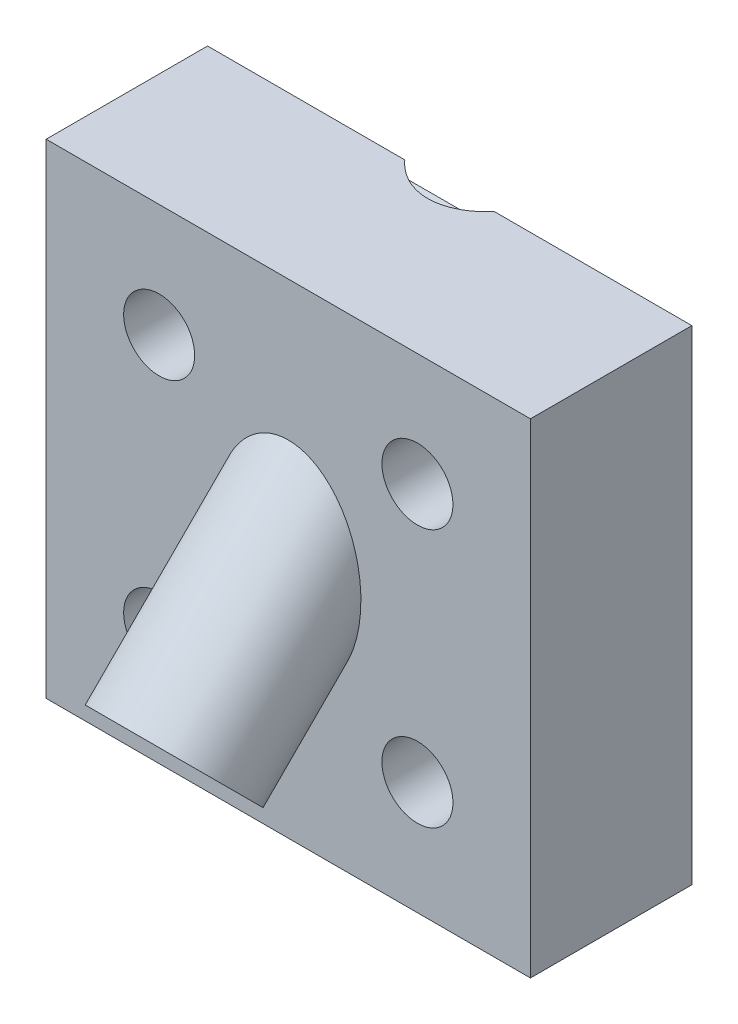
ISO-10303-21;
HEADER;
FILE_DESCRIPTION(('STEP AP214'),'2;1');
FILE_NAME('part.step','',(''),(''),'','','');
FILE_SCHEMA(('AUTOMOTIVE_DESIGN { 1 0 10303 214 1 1 1 1 }'));
ENDSEC;
DATA;
#1=APPLICATION_CONTEXT('core data for automotive mechanical design processes');
#2=APPLICATION_PROTOCOL_DEFINITION('international standard','automotive_design',2000,#1);
#3=PRODUCT_CONTEXT('',#1,'mechanical');
#4=PRODUCT('Part','Part','',(#3));
#5=PRODUCT_RELATED_PRODUCT_CATEGORY('part','',(#4));
#6=PRODUCT_DEFINITION_FORMATION('','',#4);
#7=PRODUCT_DEFINITION_CONTEXT('part definition',#1,'design');
#8=PRODUCT_DEFINITION('design','',#6,#7);
#9=PRODUCT_DEFINITION_SHAPE('','',#8);
#10=(LENGTH_UNIT() NAMED_UNIT(*) SI_UNIT(.MILLI.,.METRE.));
#11=(NAMED_UNIT(*) PLANE_ANGLE_UNIT() SI_UNIT($,.RADIAN.));
#12=(NAMED_UNIT(*) SI_UNIT($,.STERADIAN.) SOLID_ANGLE_UNIT());
#13=UNCERTAINTY_MEASURE_WITH_UNIT(LENGTH_MEASURE(1.E-05),#10,'distance_accuracy_value','');
#14=(GEOMETRIC_REPRESENTATION_CONTEXT(3) GLOBAL_UNCERTAINTY_ASSIGNED_CONTEXT((#13)) GLOBAL_UNIT_ASSIGNED_CONTEXT((#10,
#11,#12)) REPRESENTATION_CONTEXT('',''));
#15=CARTESIAN_POINT('',(0.,0.,0.));
#16=DIRECTION('',(0.,0.,1.));
#17=DIRECTION('',(1.,0.,0.));
#18=AXIS2_PLACEMENT_3D('',#15,#16,#17);
#19=CARTESIAN_POINT('',(7.5,-0.428932188134514,-3.07106781186546));
#20=DIRECTION('',(0.,-0.707106781186549,0.707106781186546));
#21=DIRECTION('',(0.,-0.707106781186546,-0.707106781186549));
#22=AXIS2_PLACEMENT_3D('',#19,#20,#21);
#23=CYLINDRICAL_SURFACE('',#22,2.25);
#24=CARTESIAN_POINT('',(7.5,-2.49999999999998,-1.));
#25=DIRECTION('',(0.,0.,1.));
#26=DIRECTION('',(0.,-1.,0.));
#27=AXIS2_PLACEMENT_3D('',#24,#25,#26);
#28=ELLIPSE('',#27,3.18198051533947,2.25);
#29=CARTESIAN_POINT('',(5.76199746786343,-0.479184719828697,-1.));
#30=VERTEX_POINT('',#29);
#31=CARTESIAN_POINT('',(9.23800253213657,-0.479184719828697,-1.));
#32=VERTEX_POINT('',#31);
#33=EDGE_CURVE('E185',#30,#32,#28,.T.);
#34=ORIENTED_EDGE('',*,*,#33,.F.);
#35=CARTESIAN_POINT('',(7.5,-1.48959235991434,-2.01040764008564));
#36=DIRECTION('',(0.,0.707106781186549,-0.707106781186546));
#37=DIRECTION('',(0.,0.707106781186546,0.707106781186549));
#38=AXIS2_PLACEMENT_3D('',#35,#36,#37);
#39=CIRCLE('',#38,2.25);
#40=EDGE_CURVE('E117',#32,#30,#39,.T.);
#41=ORIENTED_EDGE('',*,*,#40,.F.);
#42=EDGE_LOOP('',(#34,#41));
#43=FACE_BOUND('',#42,.T.);
#44=ADVANCED_FACE('F41',(#43),#23,.T.);
#45=CARTESIAN_POINT('',(7.5,0.,-3.49999999999998));
#46=DIRECTION('',(0.,-1.,0.));
#47=DIRECTION('',(0.,0.,1.));
#48=AXIS2_PLACEMENT_3D('',#45,#46,#47);
#49=ELLIPSE('',#48,3.18198051533946,2.25);
#50=CARTESIAN_POINT('',(8.29039812915369,0.,-0.520815280171302));
#51=VERTEX_POINT('',#50);
#52=CARTESIAN_POINT('',(6.70960187084631,0.,-0.520815280171302));
#53=VERTEX_POINT('',#52);
#54=EDGE_CURVE('E118',#51,#53,#49,.T.);
#55=ORIENTED_EDGE('',*,*,#54,.F.);
#56=EDGE_CURVE('E105',#53,#51,#39,.T.);
#57=ORIENTED_EDGE('',*,*,#56,.F.);
#58=EDGE_LOOP('',(#55,#57));
#59=FACE_BOUND('',#58,.T.);
#60=ADVANCED_FACE('F119',(#59),#23,.T.);
#61=CARTESIAN_POINT('',(7.5,19.3700576850888,-22.8700576850888));
#62=DIRECTION('',(0.,-0.707106781186549,0.707106781186546));
#63=DIRECTION('',(0.,-0.707106781186546,-0.707106781186549));
#64=AXIS2_PLACEMENT_3D('',#61,#62,#63);
#65=CYLINDRICAL_SURFACE('',#64,1.5);
#66=CARTESIAN_POINT('',(7.5,-11.0355339059327,7.53553390593273));
#67=DIRECTION('',(0.,-0.707106781186549,0.707106781186546));
#68=DIRECTION('',(0.,-0.707106781186546,-0.707106781186549));
#69=AXIS2_PLACEMENT_3D('',#66,#67,#68);
#70=CIRCLE('',#69,1.5);
#71=CARTESIAN_POINT('',(7.5,-12.0961940777126,6.4748737341529));
#72=VERTEX_POINT('',#71);
#73=EDGE_CURVE('E191',#72,#72,#70,.T.);
#74=ORIENTED_EDGE('',*,*,#73,.T.);
#75=EDGE_LOOP('',(#74));
#76=FACE_BOUND('',#75,.T.);
#77=CARTESIAN_POINT('',(7.5,-1.48959235991434,-2.01040764008565));
#78=DIRECTION('',(0.,0.707106781186549,-0.707106781186546));
#79=DIRECTION('',(0.,0.707106781186546,0.707106781186549));
#80=AXIS2_PLACEMENT_3D('',#77,#78,#79);
#81=CIRCLE('',#80,1.5);
#82=CARTESIAN_POINT('',(7.5,-0.42893218813452,-0.949747468305831));
#83=VERTEX_POINT('',#82);
#84=EDGE_CURVE('E44',#83,#83,#81,.F.);
#85=ORIENTED_EDGE('',*,*,#84,.F.);
#86=EDGE_LOOP('',(#85));
#87=FACE_BOUND('',#86,.T.);
#88=ADVANCED_FACE('F218',(#76,#87),#65,.F.);
#89=CARTESIAN_POINT('',(0.,0.,4.));
#90=DIRECTION('',(0.,0.,1.));
#91=DIRECTION('',(1.,0.,0.));
#92=AXIS2_PLACEMENT_3D('',#89,#90,#91);
#93=PLANE('',#92);
#94=CARTESIAN_POINT('',(7.5,-7.5,4.));
#95=DIRECTION('',(0.,0.,1.));
#96=DIRECTION('',(0.,-1.,0.));
#97=AXIS2_PLACEMENT_3D('',#94,#95,#96);
#98=ELLIPSE('',#97,3.18198051533947,2.25);
#99=CARTESIAN_POINT('',(7.5,-10.6819805153395,4.));
#100=VERTEX_POINT('',#99);
#101=EDGE_CURVE('E11',#100,#100,#98,.T.);
#102=ORIENTED_EDGE('',*,*,#101,.F.);
#103=EDGE_LOOP('',(#102));
#104=FACE_BOUND('',#103,.T.);
#105=CARTESIAN_POINT('',(11.5,-11.5,4.));
#106=DIRECTION('',(0.,0.,1.));
#107=DIRECTION('',(1.,0.,0.));
#108=AXIS2_PLACEMENT_3D('',#105,#106,#107);
#109=CIRCLE('',#108,1.1);
#110=CARTESIAN_POINT('',(12.6,-11.5,4.));
#111=VERTEX_POINT('',#110);
#112=EDGE_CURVE('E156',#111,#111,#109,.T.);
#113=ORIENTED_EDGE('',*,*,#112,.F.);
#114=EDGE_LOOP('',(#113));
#115=FACE_BOUND('',#114,.T.);
#116=CARTESIAN_POINT('',(3.5,-3.5,4.));
#117=DIRECTION('',(0.,0.,1.));
#118=DIRECTION('',(1.,0.,0.));
#119=AXIS2_PLACEMENT_3D('',#116,#117,#118);
#120=CIRCLE('',#119,1.1);
#121=CARTESIAN_POINT('',(4.6,-3.5,4.));
#122=VERTEX_POINT('',#121);
#123=EDGE_CURVE('E164',#122,#122,#120,.T.);
#124=ORIENTED_EDGE('',*,*,#123,.F.);
#125=EDGE_LOOP('',(#124));
#126=FACE_BOUND('',#125,.T.);
#127=DIRECTION('',(0.,-1.,0.));
#128=VECTOR('',#127,1.);
#129=CARTESIAN_POINT('',(0.,0.,4.));
#130=LINE('',#129,#128);
#131=CARTESIAN_POINT('',(0.,0.,4.));
#132=VERTEX_POINT('',#131);
#133=CARTESIAN_POINT('',(0.,-15.,4.));
#134=VERTEX_POINT('',#133);
#135=EDGE_CURVE('E166',#132,#134,#130,.T.);
#136=ORIENTED_EDGE('',*,*,#135,.T.);
#137=DIRECTION('',(1.,0.,0.));
#138=VECTOR('',#137,1.);
#139=CARTESIAN_POINT('',(0.,-15.,4.));
#140=LINE('',#139,#138);
#141=CARTESIAN_POINT('',(15.,-15.,4.));
#142=VERTEX_POINT('',#141);
#143=EDGE_CURVE('E167',#134,#142,#140,.T.);
#144=ORIENTED_EDGE('',*,*,#143,.T.);
#145=DIRECTION('',(0.,1.,0.));
#146=VECTOR('',#145,1.);
#147=CARTESIAN_POINT('',(15.,0.,4.));
#148=LINE('',#147,#146);
#149=CARTESIAN_POINT('',(15.,0.,4.));
#150=VERTEX_POINT('',#149);
#151=EDGE_CURVE('E175',#142,#150,#148,.T.);
#152=ORIENTED_EDGE('',*,*,#151,.T.);
#153=DIRECTION('',(-1.,0.,0.));
#154=VECTOR('',#153,1.);
#155=CARTESIAN_POINT('',(0.,0.,4.));
#156=LINE('',#155,#154);
#157=EDGE_CURVE('E66',#150,#132,#156,.T.);
#158=ORIENTED_EDGE('',*,*,#157,.T.);
#159=EDGE_LOOP('',(#136,#144,#152,#158));
#160=FACE_BOUND('',#159,.T.);
#161=CARTESIAN_POINT('',(11.5,-3.5,4.));
#162=DIRECTION('',(0.,0.,1.));
#163=DIRECTION('',(1.,0.,0.));
#164=AXIS2_PLACEMENT_3D('',#161,#162,#163);
#165=CIRCLE('',#164,1.1);
#166=CARTESIAN_POINT('',(12.6,-3.5,4.));
#167=VERTEX_POINT('',#166);
#168=EDGE_CURVE('E162',#167,#167,#165,.T.);
#169=ORIENTED_EDGE('',*,*,#168,.F.);
#170=EDGE_LOOP('',(#169));
#171=FACE_BOUND('',#170,.T.);
#172=CARTESIAN_POINT('',(3.5,-11.5,4.));
#173=DIRECTION('',(0.,0.,1.));
#174=DIRECTION('',(1.,0.,0.));
#175=AXIS2_PLACEMENT_3D('',#172,#173,#174);
#176=CIRCLE('',#175,1.1);
#177=CARTESIAN_POINT('',(4.6,-11.5,4.));
#178=VERTEX_POINT('',#177);
#179=EDGE_CURVE('E157',#178,#178,#176,.T.);
#180=ORIENTED_EDGE('',*,*,#179,.F.);
#181=EDGE_LOOP('',(#180));
#182=FACE_BOUND('',#181,.T.);
#183=ADVANCED_FACE('F224',(#104,#115,#126,#160,#171,#182),#93,.T.);
#184=CARTESIAN_POINT('',(0.,0.,4.));
#185=DIRECTION('',(1.,0.,0.));
#186=DIRECTION('',(0.,1.,0.));
#187=AXIS2_PLACEMENT_3D('',#184,#185,#186);
#188=PLANE('',#187);
#189=DIRECTION('',(0.,0.,-1.));
#190=VECTOR('',#189,1.);
#191=CARTESIAN_POINT('',(0.,0.,4.));
#192=LINE('',#191,#190);
#193=CARTESIAN_POINT('',(0.,0.,-1.));
#194=VERTEX_POINT('',#193);
#195=EDGE_CURVE('E174',#132,#194,#192,.T.);
#196=ORIENTED_EDGE('',*,*,#195,.T.);
#197=DIRECTION('',(0.,1.,0.));
#198=VECTOR('',#197,1.);
#199=CARTESIAN_POINT('',(0.,0.,-1.));
#200=LINE('',#199,#198);
#201=CARTESIAN_POINT('',(0.,-15.,-1.));
#202=VERTEX_POINT('',#201);
#203=EDGE_CURVE('E153',#202,#194,#200,.T.);
#204=ORIENTED_EDGE('',*,*,#203,.F.);
#205=DIRECTION('',(0.,0.,-1.));
#206=VECTOR('',#205,1.);
#207=CARTESIAN_POINT('',(0.,-15.,4.));
#208=LINE('',#207,#206);
#209=EDGE_CURVE('E181',#134,#202,#208,.T.);
#210=ORIENTED_EDGE('',*,*,#209,.F.);
#211=ORIENTED_EDGE('',*,*,#135,.F.);
#212=EDGE_LOOP('',(#196,#204,#210,#211));
#213=FACE_BOUND('',#212,.T.);
#214=ADVANCED_FACE('F43',(#213),#188,.F.);
#215=CARTESIAN_POINT('',(0.,-15.,4.));
#216=DIRECTION('',(0.,1.,0.));
#217=DIRECTION('',(0.,0.,1.));
#218=AXIS2_PLACEMENT_3D('',#215,#216,#217);
#219=PLANE('',#218);
#220=ORIENTED_EDGE('',*,*,#209,.T.);
#221=DIRECTION('',(-1.,0.,0.));
#222=VECTOR('',#221,1.);
#223=CARTESIAN_POINT('',(0.,-15.,-1.));
#224=LINE('',#223,#222);
#225=CARTESIAN_POINT('',(15.,-15.,-1.));
#226=VERTEX_POINT('',#225);
#227=EDGE_CURVE('E147',#226,#202,#224,.T.);
#228=ORIENTED_EDGE('',*,*,#227,.F.);
#229=DIRECTION('',(0.,0.,-1.));
#230=VECTOR('',#229,1.);
#231=CARTESIAN_POINT('',(15.,-15.,4.));
#232=LINE('',#231,#230);
#233=EDGE_CURVE('E177',#142,#226,#232,.T.);
#234=ORIENTED_EDGE('',*,*,#233,.F.);
#235=ORIENTED_EDGE('',*,*,#143,.F.);
#236=EDGE_LOOP('',(#220,#228,#234,#235));
#237=FACE_BOUND('',#236,.T.);
#238=ADVANCED_FACE('F247',(#237),#219,.F.);
#239=CARTESIAN_POINT('',(15.,0.,4.));
#240=DIRECTION('',(-1.,0.,0.));
#241=DIRECTION('',(0.,-1.,0.));
#242=AXIS2_PLACEMENT_3D('',#239,#240,#241);
#243=PLANE('',#242);
#244=ORIENTED_EDGE('',*,*,#233,.T.);
#245=DIRECTION('',(0.,-1.,0.));
#246=VECTOR('',#245,1.);
#247=CARTESIAN_POINT('',(15.,0.,-1.));
#248=LINE('',#247,#246);
#249=CARTESIAN_POINT('',(15.,0.,-1.));
#250=VERTEX_POINT('',#249);
#251=EDGE_CURVE('E146',#250,#226,#248,.T.);
#252=ORIENTED_EDGE('',*,*,#251,.F.);
#253=DIRECTION('',(0.,0.,-1.));
#254=VECTOR('',#253,1.);
#255=CARTESIAN_POINT('',(15.,0.,4.));
#256=LINE('',#255,#254);
#257=EDGE_CURVE('E180',#150,#250,#256,.T.);
#258=ORIENTED_EDGE('',*,*,#257,.F.);
#259=ORIENTED_EDGE('',*,*,#151,.F.);
#260=EDGE_LOOP('',(#244,#252,#258,#259));
#261=FACE_BOUND('',#260,.T.);
#262=ADVANCED_FACE('F246',(#261),#243,.F.);
#263=CARTESIAN_POINT('',(0.,0.,4.));
#264=DIRECTION('',(0.,-1.,0.));
#265=DIRECTION('',(0.,0.,-1.));
#266=AXIS2_PLACEMENT_3D('',#263,#264,#265);
#267=PLANE('',#266);
#268=DIRECTION('',(1.,0.,0.));
#269=VECTOR('',#268,1.);
#270=CARTESIAN_POINT('',(15.,0.,-1.));
#271=LINE('',#270,#269);
#272=CARTESIAN_POINT('',(8.89194109070752,0.,-1.));
#273=VERTEX_POINT('',#272);
#274=EDGE_CURVE('E130',#273,#250,#271,.T.);
#275=ORIENTED_EDGE('',*,*,#274,.F.);
#276=EDGE_CURVE('E114',#273,#51,#49,.T.);
#277=ORIENTED_EDGE('',*,*,#276,.T.);
#278=ORIENTED_EDGE('',*,*,#54,.T.);
#279=CARTESIAN_POINT('',(7.5,0.,-3.49999999999998));
#280=DIRECTION('',(0.,-1.,0.));
#281=DIRECTION('',(0.,0.,-1.));
#282=AXIS2_PLACEMENT_3D('',#279,#280,#281);
#283=ELLIPSE('',#282,3.18198051533946,2.25);
#284=CARTESIAN_POINT('',(6.10805890929248,0.,-1.));
#285=VERTEX_POINT('',#284);
#286=EDGE_CURVE('E195',#53,#285,#283,.T.);
#287=ORIENTED_EDGE('',*,*,#286,.T.);
#288=EDGE_CURVE('E144',#194,#285,#271,.T.);
#289=ORIENTED_EDGE('',*,*,#288,.F.);
#290=ORIENTED_EDGE('',*,*,#195,.F.);
#291=ORIENTED_EDGE('',*,*,#157,.F.);
#292=ORIENTED_EDGE('',*,*,#257,.T.);
#293=EDGE_LOOP('',(#275,#277,#278,#287,#289,#290,#291,#292));
#294=FACE_BOUND('',#293,.T.);
#295=ADVANCED_FACE('F129',(#294),#267,.F.);
#296=CARTESIAN_POINT('',(3.5,-3.5,4.));
#297=DIRECTION('',(0.,0.,-1.));
#298=DIRECTION('',(-1.,0.,0.));
#299=AXIS2_PLACEMENT_3D('',#296,#297,#298);
#300=CYLINDRICAL_SURFACE('',#299,1.1);
#301=ORIENTED_EDGE('',*,*,#123,.T.);
#302=EDGE_LOOP('',(#301));
#303=FACE_BOUND('',#302,.T.);
#304=CARTESIAN_POINT('',(3.5,-3.5,-1.));
#305=DIRECTION('',(0.,0.,-1.));
#306=DIRECTION('',(-1.,0.,0.));
#307=AXIS2_PLACEMENT_3D('',#304,#305,#306);
#308=CIRCLE('',#307,1.1);
#309=CARTESIAN_POINT('',(2.4,-3.5,-1.));
#310=VERTEX_POINT('',#309);
#311=EDGE_CURVE('E142',#310,#310,#308,.T.);
#312=ORIENTED_EDGE('',*,*,#311,.T.);
#313=EDGE_LOOP('',(#312));
#314=FACE_BOUND('',#313,.T.);
#315=ADVANCED_FACE('F239',(#303,#314),#300,.F.);
#316=CARTESIAN_POINT('',(11.5,-3.5,4.));
#317=DIRECTION('',(0.,0.,-1.));
#318=DIRECTION('',(-1.,0.,0.));
#319=AXIS2_PLACEMENT_3D('',#316,#317,#318);
#320=CYLINDRICAL_SURFACE('',#319,1.1);
#321=ORIENTED_EDGE('',*,*,#168,.T.);
#322=EDGE_LOOP('',(#321));
#323=FACE_BOUND('',#322,.T.);
#324=CARTESIAN_POINT('',(11.5,-3.5,-1.));
#325=DIRECTION('',(0.,0.,-1.));
#326=DIRECTION('',(-1.,0.,0.));
#327=AXIS2_PLACEMENT_3D('',#324,#325,#326);
#328=CIRCLE('',#327,1.1);
#329=CARTESIAN_POINT('',(10.4,-3.5,-1.));
#330=VERTEX_POINT('',#329);
#331=EDGE_CURVE('E140',#330,#330,#328,.T.);
#332=ORIENTED_EDGE('',*,*,#331,.T.);
#333=EDGE_LOOP('',(#332));
#334=FACE_BOUND('',#333,.T.);
#335=ADVANCED_FACE('F236',(#323,#334),#320,.F.);
#336=CARTESIAN_POINT('',(11.5,-11.5,4.));
#337=DIRECTION('',(0.,0.,-1.));
#338=DIRECTION('',(-1.,0.,0.));
#339=AXIS2_PLACEMENT_3D('',#336,#337,#338);
#340=CYLINDRICAL_SURFACE('',#339,1.1);
#341=ORIENTED_EDGE('',*,*,#112,.T.);
#342=EDGE_LOOP('',(#341));
#343=FACE_BOUND('',#342,.T.);
#344=CARTESIAN_POINT('',(11.5,-11.5,-1.));
#345=DIRECTION('',(0.,0.,-1.));
#346=DIRECTION('',(-1.,0.,0.));
#347=AXIS2_PLACEMENT_3D('',#344,#345,#346);
#348=CIRCLE('',#347,1.1);
#349=CARTESIAN_POINT('',(10.4,-11.5,-1.));
#350=VERTEX_POINT('',#349);
#351=EDGE_CURVE('E131',#350,#350,#348,.T.);
#352=ORIENTED_EDGE('',*,*,#351,.T.);
#353=EDGE_LOOP('',(#352));
#354=FACE_BOUND('',#353,.T.);
#355=ADVANCED_FACE('F235',(#343,#354),#340,.F.);
#356=CARTESIAN_POINT('',(3.5,-11.5,4.));
#357=DIRECTION('',(0.,0.,-1.));
#358=DIRECTION('',(-1.,0.,0.));
#359=AXIS2_PLACEMENT_3D('',#356,#357,#358);
#360=CYLINDRICAL_SURFACE('',#359,1.1);
#361=ORIENTED_EDGE('',*,*,#179,.T.);
#362=EDGE_LOOP('',(#361));
#363=FACE_BOUND('',#362,.T.);
#364=CARTESIAN_POINT('',(3.5,-11.5,-1.));
#365=DIRECTION('',(0.,0.,-1.));
#366=DIRECTION('',(-1.,0.,0.));
#367=AXIS2_PLACEMENT_3D('',#364,#365,#366);
#368=CIRCLE('',#367,1.1);
#369=CARTESIAN_POINT('',(2.4,-11.5,-1.));
#370=VERTEX_POINT('',#369);
#371=EDGE_CURVE('E128',#370,#370,#368,.T.);
#372=ORIENTED_EDGE('',*,*,#371,.T.);
#373=EDGE_LOOP('',(#372));
#374=FACE_BOUND('',#373,.T.);
#375=ADVANCED_FACE('F215',(#363,#374),#360,.F.);
#376=CARTESIAN_POINT('',(0.,0.,-1.));
#377=DIRECTION('',(0.,0.,1.));
#378=DIRECTION('',(1.,0.,0.));
#379=AXIS2_PLACEMENT_3D('',#376,#377,#378);
#380=PLANE('',#379);
#381=ORIENTED_EDGE('',*,*,#288,.T.);
#382=EDGE_CURVE('E49',#285,#30,#28,.T.);
#383=ORIENTED_EDGE('',*,*,#382,.T.);
#384=ORIENTED_EDGE('',*,*,#33,.T.);
#385=CARTESIAN_POINT('',(7.5,-2.49999999999998,-1.));
#386=DIRECTION('',(0.,0.,1.));
#387=DIRECTION('',(0.,1.,0.));
#388=AXIS2_PLACEMENT_3D('',#385,#386,#387);
#389=ELLIPSE('',#388,3.18198051533947,2.25);
#390=EDGE_CURVE('E120',#32,#273,#389,.T.);
#391=ORIENTED_EDGE('',*,*,#390,.T.);
#392=ORIENTED_EDGE('',*,*,#274,.T.);
#393=ORIENTED_EDGE('',*,*,#251,.T.);
#394=ORIENTED_EDGE('',*,*,#227,.T.);
#395=ORIENTED_EDGE('',*,*,#203,.T.);
#396=EDGE_LOOP('',(#381,#383,#384,#391,#392,#393,#394,#395));
#397=FACE_BOUND('',#396,.T.);
#398=ORIENTED_EDGE('',*,*,#311,.F.);
#399=EDGE_LOOP('',(#398));
#400=FACE_BOUND('',#399,.T.);
#401=ORIENTED_EDGE('',*,*,#331,.F.);
#402=EDGE_LOOP('',(#401));
#403=FACE_BOUND('',#402,.T.);
#404=ORIENTED_EDGE('',*,*,#351,.F.);
#405=EDGE_LOOP('',(#404));
#406=FACE_BOUND('',#405,.T.);
#407=ORIENTED_EDGE('',*,*,#371,.F.);
#408=EDGE_LOOP('',(#407));
#409=FACE_BOUND('',#408,.T.);
#410=ADVANCED_FACE('F190',(#397,#400,#403,#406,#409),#380,.F.);
#411=ORIENTED_EDGE('',*,*,#101,.T.);
#412=EDGE_LOOP('',(#411));
#413=FACE_BOUND('',#412,.T.);
#414=CARTESIAN_POINT('',(7.5,-11.0355339059327,7.53553390593273));
#415=DIRECTION('',(0.,-0.707106781186549,0.707106781186546));
#416=DIRECTION('',(0.,-0.707106781186546,-0.707106781186549));
#417=AXIS2_PLACEMENT_3D('',#414,#415,#416);
#418=CIRCLE('',#417,2.25);
#419=CARTESIAN_POINT('',(7.5,-12.6265241636025,5.944543648263));
#420=VERTEX_POINT('',#419);
#421=EDGE_CURVE('E124',#420,#420,#418,.T.);
#422=ORIENTED_EDGE('',*,*,#421,.F.);
#423=EDGE_LOOP('',(#422));
#424=FACE_BOUND('',#423,.T.);
#425=ADVANCED_FACE('F205',(#413,#424),#23,.T.);
#426=CARTESIAN_POINT('',(7.5,-11.0355339059327,7.53553390593273));
#427=DIRECTION('',(0.,-0.707106781186549,0.707106781186546));
#428=DIRECTION('',(0.,-0.707106781186546,-0.707106781186549));
#429=AXIS2_PLACEMENT_3D('',#426,#427,#428);
#430=PLANE('',#429);
#431=ORIENTED_EDGE('',*,*,#421,.T.);
#432=EDGE_LOOP('',(#431));
#433=FACE_BOUND('',#432,.T.);
#434=ORIENTED_EDGE('',*,*,#73,.F.);
#435=EDGE_LOOP('',(#434));
#436=FACE_BOUND('',#435,.T.);
#437=ADVANCED_FACE('F199',(#433,#436),#430,.T.);
#438=CARTESIAN_POINT('',(7.5,-1.48959235991434,-2.01040764008564));
#439=DIRECTION('',(0.,0.707106781186548,-0.707106781186546));
#440=DIRECTION('',(0.,0.707106781186546,0.707106781186549));
#441=AXIS2_PLACEMENT_3D('',#438,#439,#440);
#442=CYLINDRICAL_SURFACE('',#441,2.25);
#443=ORIENTED_EDGE('',*,*,#390,.F.);
#444=EDGE_CURVE('E106',#51,#32,#39,.T.);
#445=ORIENTED_EDGE('',*,*,#444,.F.);
#446=ORIENTED_EDGE('',*,*,#276,.F.);
#447=EDGE_LOOP('',(#443,#445,#446));
#448=FACE_BOUND('',#447,.T.);
#449=ADVANCED_FACE('F113',(#448),#442,.F.);
#450=EDGE_CURVE('E59',#30,#53,#39,.T.);
#451=ORIENTED_EDGE('',*,*,#450,.F.);
#452=ORIENTED_EDGE('',*,*,#382,.F.);
#453=ORIENTED_EDGE('',*,*,#286,.F.);
#454=EDGE_LOOP('',(#451,#452,#453));
#455=FACE_BOUND('',#454,.T.);
#456=ADVANCED_FACE('F262',(#455),#442,.F.);
#457=CARTESIAN_POINT('',(7.5,-1.48959235991434,-2.01040764008564));
#458=DIRECTION('',(0.,0.707106781186549,-0.707106781186546));
#459=DIRECTION('',(0.,0.707106781186546,0.707106781186549));
#460=AXIS2_PLACEMENT_3D('',#457,#458,#459);
#461=PLANE('',#460);
#462=ORIENTED_EDGE('',*,*,#444,.T.);
#463=ORIENTED_EDGE('',*,*,#40,.T.);
#464=ORIENTED_EDGE('',*,*,#450,.T.);
#465=ORIENTED_EDGE('',*,*,#56,.T.);
#466=EDGE_LOOP('',(#462,#463,#464,#465));
#467=FACE_BOUND('',#466,.T.);
#468=ORIENTED_EDGE('',*,*,#84,.T.);
#469=EDGE_LOOP('',(#468));
#470=FACE_BOUND('',#469,.T.);
#471=ADVANCED_FACE('F104',(#467,#470),#461,.T.);
#472=CLOSED_SHELL('',(#44,#60,#88,#183,#214,#238,#262,#295,#315,#335,#355,#375,#410,#425,#437,
#449,#456,#471));
#473=MANIFOLD_SOLID_BREP('B2',#472);
#474=ADVANCED_BREP_SHAPE_REPRESENTATION('',(#18,#473),#14);
#475=SHAPE_DEFINITION_REPRESENTATION(#9,#474);
ENDSEC;
END-ISO-10303-21;
